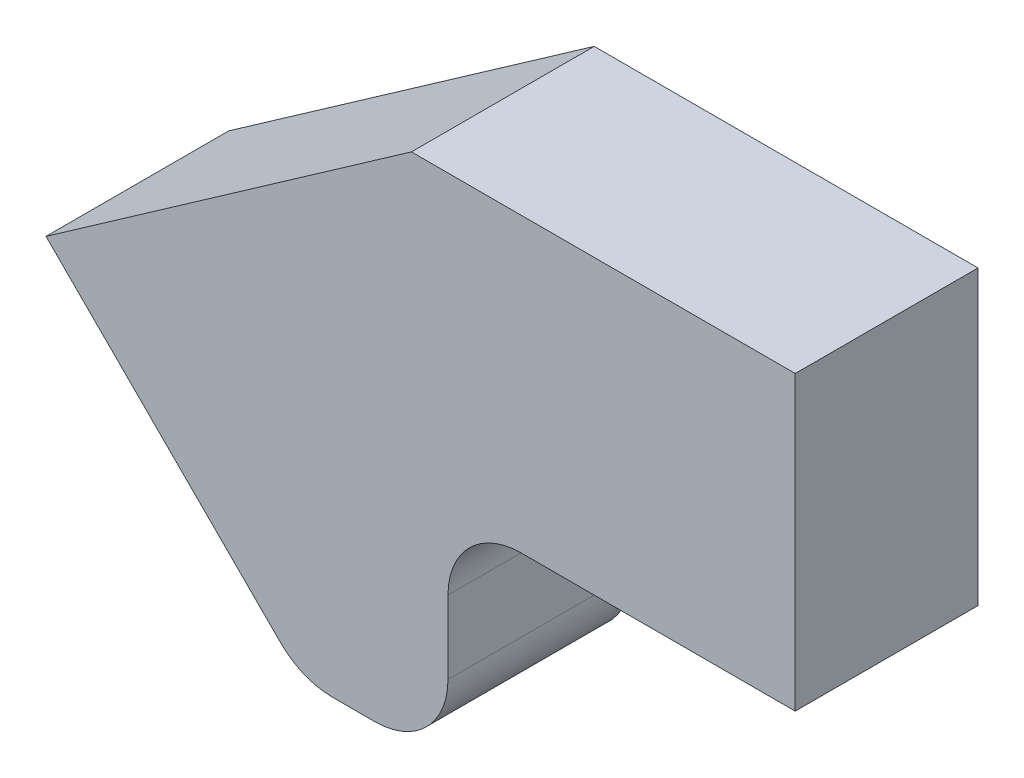
ISO-10303-21;
HEADER;
FILE_DESCRIPTION(('STEP AP214'),'2;1');
FILE_NAME('part.step','',(''),(''),'','','');
FILE_SCHEMA(('AUTOMOTIVE_DESIGN { 1 0 10303 214 1 1 1 1 }'));
ENDSEC;
DATA;
#1=APPLICATION_CONTEXT('core data for automotive mechanical design processes');
#2=APPLICATION_PROTOCOL_DEFINITION('international standard','automotive_design',2000,#1);
#3=PRODUCT_CONTEXT('',#1,'mechanical');
#4=PRODUCT('Part','Part','',(#3));
#5=PRODUCT_RELATED_PRODUCT_CATEGORY('part','',(#4));
#6=PRODUCT_DEFINITION_FORMATION('','',#4);
#7=PRODUCT_DEFINITION_CONTEXT('part definition',#1,'design');
#8=PRODUCT_DEFINITION('design','',#6,#7);
#9=PRODUCT_DEFINITION_SHAPE('','',#8);
#10=(LENGTH_UNIT() NAMED_UNIT(*) SI_UNIT(.MILLI.,.METRE.));
#11=(NAMED_UNIT(*) PLANE_ANGLE_UNIT() SI_UNIT($,.RADIAN.));
#12=(NAMED_UNIT(*) SI_UNIT($,.STERADIAN.) SOLID_ANGLE_UNIT());
#13=UNCERTAINTY_MEASURE_WITH_UNIT(LENGTH_MEASURE(1.E-05),#10,'distance_accuracy_value','');
#14=(GEOMETRIC_REPRESENTATION_CONTEXT(3) GLOBAL_UNCERTAINTY_ASSIGNED_CONTEXT((#13)) GLOBAL_UNIT_ASSIGNED_CONTEXT((#10,
#11,#12)) REPRESENTATION_CONTEXT('',''));
#15=CARTESIAN_POINT('',(0.,0.,0.));
#16=DIRECTION('',(0.,0.,1.));
#17=DIRECTION('',(1.,0.,0.));
#18=AXIS2_PLACEMENT_3D('',#15,#16,#17);
#19=CARTESIAN_POINT('',(0.350000000000004,-0.35,0.125));
#20=DIRECTION('',(0.707106781186544,0.707106781186552,0.));
#21=DIRECTION('',(-0.707106781186551,0.707106781186544,0.));
#22=AXIS2_PLACEMENT_3D('',#19,#20,#21);
#23=PLANE('',#22);
#24=DIRECTION('',(0.707106781186551,-0.707106781186544,0.));
#25=VECTOR('',#24,1.);
#26=CARTESIAN_POINT('',(0.350000000000004,-0.35,-0.125));
#27=LINE('',#26,#25);
#28=CARTESIAN_POINT('',(0.,0.,-0.125));
#29=VERTEX_POINT('',#28);
#30=CARTESIAN_POINT('',(0.320710678118659,-0.320710678118655,-0.125));
#31=VERTEX_POINT('',#30);
#32=EDGE_CURVE('E141',#29,#31,#27,.T.);
#33=ORIENTED_EDGE('',*,*,#32,.T.);
#34=DIRECTION('',(0.,0.,-1.));
#35=VECTOR('',#34,1.);
#36=CARTESIAN_POINT('',(0.320710678118659,-0.320710678118655,0.125));
#37=LINE('',#36,#35);
#38=CARTESIAN_POINT('',(0.320710678118659,-0.320710678118655,0.125));
#39=VERTEX_POINT('',#38);
#40=EDGE_CURVE('E54',#31,#39,#37,.F.);
#41=ORIENTED_EDGE('',*,*,#40,.T.);
#42=DIRECTION('',(0.707106781186551,-0.707106781186544,0.));
#43=VECTOR('',#42,1.);
#44=CARTESIAN_POINT('',(0.350000000000004,-0.35,0.125));
#45=LINE('',#44,#43);
#46=CARTESIAN_POINT('',(0.,0.,0.125));
#47=VERTEX_POINT('',#46);
#48=EDGE_CURVE('E156',#47,#39,#45,.T.);
#49=ORIENTED_EDGE('',*,*,#48,.F.);
#50=DIRECTION('',(0.,0.,-1.));
#51=VECTOR('',#50,1.);
#52=CARTESIAN_POINT('',(0.,0.,0.125));
#53=LINE('',#52,#51);
#54=EDGE_CURVE('E140',#47,#29,#53,.T.);
#55=ORIENTED_EDGE('',*,*,#54,.T.);
#56=EDGE_LOOP('',(#33,#41,#49,#55));
#57=FACE_BOUND('',#56,.T.);
#58=ADVANCED_FACE('F33',(#57),#23,.F.);
#59=CARTESIAN_POINT('',(0.549851802359739,-0.35,0.125));
#60=DIRECTION('',(0.,1.,0.));
#61=DIRECTION('',(0.,0.,1.));
#62=AXIS2_PLACEMENT_3D('',#59,#60,#61);
#63=PLANE('',#62);
#64=DIRECTION('',(1.,0.,0.));
#65=VECTOR('',#64,1.);
#66=CARTESIAN_POINT('',(0.549851802359739,-0.35,-0.125));
#67=LINE('',#66,#65);
#68=CARTESIAN_POINT('',(0.391421356237313,-0.35,-0.125));
#69=VERTEX_POINT('',#68);
#70=CARTESIAN_POINT('',(0.449851802359739,-0.35,-0.125));
#71=VERTEX_POINT('',#70);
#72=EDGE_CURVE('E143',#69,#71,#67,.T.);
#73=ORIENTED_EDGE('',*,*,#72,.T.);
#74=DIRECTION('',(0.,0.,-1.));
#75=VECTOR('',#74,1.);
#76=CARTESIAN_POINT('',(0.449851802359739,-0.35,0.125));
#77=LINE('',#76,#75);
#78=CARTESIAN_POINT('',(0.449851802359739,-0.35,0.125));
#79=VERTEX_POINT('',#78);
#80=EDGE_CURVE('E174',#71,#79,#77,.F.);
#81=ORIENTED_EDGE('',*,*,#80,.T.);
#82=DIRECTION('',(1.,0.,0.));
#83=VECTOR('',#82,1.);
#84=CARTESIAN_POINT('',(0.549851802359739,-0.35,0.125));
#85=LINE('',#84,#83);
#86=CARTESIAN_POINT('',(0.391421356237313,-0.35,0.125));
#87=VERTEX_POINT('',#86);
#88=EDGE_CURVE('E306',#87,#79,#85,.T.);
#89=ORIENTED_EDGE('',*,*,#88,.F.);
#90=DIRECTION('',(0.,0.,-1.));
#91=VECTOR('',#90,1.);
#92=CARTESIAN_POINT('',(0.391421356237313,-0.35,0.125));
#93=LINE('',#92,#91);
#94=EDGE_CURVE('E171',#87,#69,#93,.T.);
#95=ORIENTED_EDGE('',*,*,#94,.T.);
#96=EDGE_LOOP('',(#73,#81,#89,#95));
#97=FACE_BOUND('',#96,.T.);
#98=ADVANCED_FACE('F202',(#97),#63,.F.);
#99=CARTESIAN_POINT('',(0.549851802359739,-0.0500000000000001,0.125));
#100=DIRECTION('',(-1.,0.,0.));
#101=DIRECTION('',(0.,-1.,0.));
#102=AXIS2_PLACEMENT_3D('',#99,#100,#101);
#103=PLANE('',#102);
#104=DIRECTION('',(0.,1.,0.));
#105=VECTOR('',#104,1.);
#106=CARTESIAN_POINT('',(0.549851802359739,-0.0500000000000001,0.125));
#107=LINE('',#106,#105);
#108=CARTESIAN_POINT('',(0.549851802359739,-0.25,0.125));
#109=VERTEX_POINT('',#108);
#110=CARTESIAN_POINT('',(0.549851802359739,-0.15,0.125));
#111=VERTEX_POINT('',#110);
#112=EDGE_CURVE('E118',#109,#111,#107,.T.);
#113=ORIENTED_EDGE('',*,*,#112,.F.);
#114=DIRECTION('',(0.,0.,-1.));
#115=VECTOR('',#114,1.);
#116=CARTESIAN_POINT('',(0.549851802359739,-0.25,0.125));
#117=LINE('',#116,#115);
#118=CARTESIAN_POINT('',(0.549851802359739,-0.25,-0.125));
#119=VERTEX_POINT('',#118);
#120=EDGE_CURVE('E164',#109,#119,#117,.T.);
#121=ORIENTED_EDGE('',*,*,#120,.T.);
#122=DIRECTION('',(0.,1.,0.));
#123=VECTOR('',#122,1.);
#124=CARTESIAN_POINT('',(0.549851802359739,-0.0500000000000001,-0.125));
#125=LINE('',#124,#123);
#126=CARTESIAN_POINT('',(0.549851802359739,-0.15,-0.125));
#127=VERTEX_POINT('',#126);
#128=EDGE_CURVE('E146',#119,#127,#125,.T.);
#129=ORIENTED_EDGE('',*,*,#128,.T.);
#130=DIRECTION('',(0.,0.,-1.));
#131=VECTOR('',#130,1.);
#132=CARTESIAN_POINT('',(0.549851802359739,-0.15,0.125));
#133=LINE('',#132,#131);
#134=EDGE_CURVE('E127',#127,#111,#133,.F.);
#135=ORIENTED_EDGE('',*,*,#134,.T.);
#136=EDGE_LOOP('',(#113,#121,#129,#135));
#137=FACE_BOUND('',#136,.T.);
#138=ADVANCED_FACE('F189',(#137),#103,.F.);
#139=CARTESIAN_POINT('',(1.02485180235974,-0.05,0.125));
#140=DIRECTION('',(0.,1.,0.));
#141=DIRECTION('',(-1.,0.,0.));
#142=AXIS2_PLACEMENT_3D('',#139,#140,#141);
#143=PLANE('',#142);
#144=DIRECTION('',(1.,0.,0.));
#145=VECTOR('',#144,1.);
#146=CARTESIAN_POINT('',(1.02485180235974,-0.05,0.125));
#147=LINE('',#146,#145);
#148=CARTESIAN_POINT('',(0.649851802359739,-0.0500000000000001,0.125));
#149=VERTEX_POINT('',#148);
#150=CARTESIAN_POINT('',(1.02485180235974,-0.05,0.125));
#151=VERTEX_POINT('',#150);
#152=EDGE_CURVE('E108',#149,#151,#147,.T.);
#153=ORIENTED_EDGE('',*,*,#152,.F.);
#154=DIRECTION('',(0.,0.,-1.));
#155=VECTOR('',#154,1.);
#156=CARTESIAN_POINT('',(0.649851802359739,-0.0500000000000001,-0.125));
#157=LINE('',#156,#155);
#158=CARTESIAN_POINT('',(0.649851802359739,-0.0500000000000001,-0.125));
#159=VERTEX_POINT('',#158);
#160=EDGE_CURVE('E180',#149,#159,#157,.T.);
#161=ORIENTED_EDGE('',*,*,#160,.T.);
#162=DIRECTION('',(1.,0.,0.));
#163=VECTOR('',#162,1.);
#164=CARTESIAN_POINT('',(1.02485180235974,-0.05,-0.125));
#165=LINE('',#164,#163);
#166=CARTESIAN_POINT('',(1.02485180235974,-0.05,-0.125));
#167=VERTEX_POINT('',#166);
#168=EDGE_CURVE('E124',#159,#167,#165,.T.);
#169=ORIENTED_EDGE('',*,*,#168,.T.);
#170=DIRECTION('',(0.,0.,-1.));
#171=VECTOR('',#170,1.);
#172=CARTESIAN_POINT('',(1.02485180235974,-0.05,0.125));
#173=LINE('',#172,#171);
#174=EDGE_CURVE('E121',#151,#167,#173,.T.);
#175=ORIENTED_EDGE('',*,*,#174,.F.);
#176=EDGE_LOOP('',(#153,#161,#169,#175));
#177=FACE_BOUND('',#176,.T.);
#178=ADVANCED_FACE('F122',(#177),#143,.F.);
#179=CARTESIAN_POINT('',(1.02485180235974,0.35,0.125));
#180=DIRECTION('',(-1.,0.,0.));
#181=DIRECTION('',(0.,0.,1.));
#182=AXIS2_PLACEMENT_3D('',#179,#180,#181);
#183=PLANE('',#182);
#184=DIRECTION('',(0.,1.,0.));
#185=VECTOR('',#184,1.);
#186=CARTESIAN_POINT('',(1.02485180235974,0.35,-0.125));
#187=LINE('',#186,#185);
#188=CARTESIAN_POINT('',(1.02485180235974,0.35,-0.125));
#189=VERTEX_POINT('',#188);
#190=EDGE_CURVE('E150',#167,#189,#187,.T.);
#191=ORIENTED_EDGE('',*,*,#190,.T.);
#192=DIRECTION('',(0.,0.,-1.));
#193=VECTOR('',#192,1.);
#194=CARTESIAN_POINT('',(1.02485180235974,0.35,0.125));
#195=LINE('',#194,#193);
#196=CARTESIAN_POINT('',(1.02485180235974,0.35,0.125));
#197=VERTEX_POINT('',#196);
#198=EDGE_CURVE('E128',#197,#189,#195,.T.);
#199=ORIENTED_EDGE('',*,*,#198,.F.);
#200=DIRECTION('',(0.,1.,0.));
#201=VECTOR('',#200,1.);
#202=CARTESIAN_POINT('',(1.02485180235974,0.35,0.125));
#203=LINE('',#202,#201);
#204=EDGE_CURVE('E113',#151,#197,#203,.T.);
#205=ORIENTED_EDGE('',*,*,#204,.F.);
#206=ORIENTED_EDGE('',*,*,#174,.T.);
#207=EDGE_LOOP('',(#191,#199,#205,#206));
#208=FACE_BOUND('',#207,.T.);
#209=ADVANCED_FACE('F130',(#208),#183,.F.);
#210=CARTESIAN_POINT('',(0.499851802359739,0.35,0.125));
#211=DIRECTION('',(0.,-1.,0.));
#212=DIRECTION('',(1.,0.,0.));
#213=AXIS2_PLACEMENT_3D('',#210,#211,#212);
#214=PLANE('',#213);
#215=DIRECTION('',(-1.,0.,0.));
#216=VECTOR('',#215,1.);
#217=CARTESIAN_POINT('',(0.499851802359739,0.35,-0.125));
#218=LINE('',#217,#216);
#219=CARTESIAN_POINT('',(0.499851802359739,0.35,-0.125));
#220=VERTEX_POINT('',#219);
#221=EDGE_CURVE('E152',#189,#220,#218,.T.);
#222=ORIENTED_EDGE('',*,*,#221,.T.);
#223=DIRECTION('',(0.,0.,-1.));
#224=VECTOR('',#223,1.);
#225=CARTESIAN_POINT('',(0.499851802359739,0.35,0.125));
#226=LINE('',#225,#224);
#227=CARTESIAN_POINT('',(0.499851802359739,0.35,0.125));
#228=VERTEX_POINT('',#227);
#229=EDGE_CURVE('E159',#228,#220,#226,.T.);
#230=ORIENTED_EDGE('',*,*,#229,.F.);
#231=DIRECTION('',(-1.,0.,0.));
#232=VECTOR('',#231,1.);
#233=CARTESIAN_POINT('',(0.499851802359739,0.35,0.125));
#234=LINE('',#233,#232);
#235=EDGE_CURVE('E133',#197,#228,#234,.T.);
#236=ORIENTED_EDGE('',*,*,#235,.F.);
#237=ORIENTED_EDGE('',*,*,#198,.T.);
#238=EDGE_LOOP('',(#222,#230,#236,#237));
#239=FACE_BOUND('',#238,.T.);
#240=ADVANCED_FACE('F216',(#239),#214,.F.);
#241=CARTESIAN_POINT('',(0.,0.,0.125));
#242=DIRECTION('',(0.573576436351047,-0.819152044288991,0.));
#243=DIRECTION('',(0.819152044288991,0.573576436351047,0.));
#244=AXIS2_PLACEMENT_3D('',#241,#242,#243);
#245=PLANE('',#244);
#246=DIRECTION('',(-0.819152044288991,-0.573576436351047,0.));
#247=VECTOR('',#246,1.);
#248=CARTESIAN_POINT('',(0.,0.,-0.125));
#249=LINE('',#248,#247);
#250=EDGE_CURVE('E154',#220,#29,#249,.T.);
#251=ORIENTED_EDGE('',*,*,#250,.T.);
#252=ORIENTED_EDGE('',*,*,#54,.F.);
#253=DIRECTION('',(-0.819152044288991,-0.573576436351047,0.));
#254=VECTOR('',#253,1.);
#255=CARTESIAN_POINT('',(0.,0.,0.125));
#256=LINE('',#255,#254);
#257=EDGE_CURVE('E135',#228,#47,#256,.T.);
#258=ORIENTED_EDGE('',*,*,#257,.F.);
#259=ORIENTED_EDGE('',*,*,#229,.T.);
#260=EDGE_LOOP('',(#251,#252,#258,#259));
#261=FACE_BOUND('',#260,.T.);
#262=ADVANCED_FACE('F219',(#261),#245,.F.);
#263=CARTESIAN_POINT('',(0.,0.,0.125));
#264=DIRECTION('',(0.,0.,-1.));
#265=DIRECTION('',(-1.,0.,0.));
#266=AXIS2_PLACEMENT_3D('',#263,#264,#265);
#267=PLANE('',#266);
#268=ORIENTED_EDGE('',*,*,#88,.T.);
#269=CARTESIAN_POINT('',(0.449851802359739,-0.25,0.125));
#270=DIRECTION('',(0.,0.,-1.));
#271=DIRECTION('',(-1.,0.,0.));
#272=AXIS2_PLACEMENT_3D('',#269,#270,#271);
#273=CIRCLE('',#272,0.1);
#274=EDGE_CURVE('E178',#79,#109,#273,.F.);
#275=ORIENTED_EDGE('',*,*,#274,.T.);
#276=ORIENTED_EDGE('',*,*,#112,.T.);
#277=CARTESIAN_POINT('',(0.649851802359739,-0.15,0.125));
#278=DIRECTION('',(0.,0.,-1.));
#279=DIRECTION('',(-1.,0.,0.));
#280=AXIS2_PLACEMENT_3D('',#277,#278,#279);
#281=CIRCLE('',#280,0.1);
#282=EDGE_CURVE('E11',#111,#149,#281,.T.);
#283=ORIENTED_EDGE('',*,*,#282,.T.);
#284=ORIENTED_EDGE('',*,*,#152,.T.);
#285=ORIENTED_EDGE('',*,*,#204,.T.);
#286=ORIENTED_EDGE('',*,*,#235,.T.);
#287=ORIENTED_EDGE('',*,*,#257,.T.);
#288=ORIENTED_EDGE('',*,*,#48,.T.);
#289=CARTESIAN_POINT('',(0.391421356237313,-0.25,0.125));
#290=DIRECTION('',(0.,0.,-1.));
#291=DIRECTION('',(-1.,0.,0.));
#292=AXIS2_PLACEMENT_3D('',#289,#290,#291);
#293=CIRCLE('',#292,0.1);
#294=EDGE_CURVE('E176',#39,#87,#293,.F.);
#295=ORIENTED_EDGE('',*,*,#294,.T.);
#296=EDGE_LOOP('',(#268,#275,#276,#283,#284,#285,#286,#287,#288,#295));
#297=FACE_BOUND('',#296,.T.);
#298=ADVANCED_FACE('F111',(#297),#267,.F.);
#299=CARTESIAN_POINT('',(0.,0.,-0.125));
#300=DIRECTION('',(0.,0.,-1.));
#301=DIRECTION('',(-1.,0.,0.));
#302=AXIS2_PLACEMENT_3D('',#299,#300,#301);
#303=PLANE('',#302);
#304=ORIENTED_EDGE('',*,*,#128,.F.);
#305=CARTESIAN_POINT('',(0.449851802359739,-0.25,-0.125));
#306=DIRECTION('',(0.,0.,-1.));
#307=DIRECTION('',(-1.,0.,0.));
#308=AXIS2_PLACEMENT_3D('',#305,#306,#307);
#309=CIRCLE('',#308,0.1);
#310=EDGE_CURVE('E169',#119,#71,#309,.T.);
#311=ORIENTED_EDGE('',*,*,#310,.T.);
#312=ORIENTED_EDGE('',*,*,#72,.F.);
#313=CARTESIAN_POINT('',(0.391421356237313,-0.25,-0.125));
#314=DIRECTION('',(0.,0.,-1.));
#315=DIRECTION('',(-1.,0.,0.));
#316=AXIS2_PLACEMENT_3D('',#313,#314,#315);
#317=CIRCLE('',#316,0.1);
#318=EDGE_CURVE('E167',#69,#31,#317,.T.);
#319=ORIENTED_EDGE('',*,*,#318,.T.);
#320=ORIENTED_EDGE('',*,*,#32,.F.);
#321=ORIENTED_EDGE('',*,*,#250,.F.);
#322=ORIENTED_EDGE('',*,*,#221,.F.);
#323=ORIENTED_EDGE('',*,*,#190,.F.);
#324=ORIENTED_EDGE('',*,*,#168,.F.);
#325=CARTESIAN_POINT('',(0.649851802359739,-0.15,-0.125));
#326=DIRECTION('',(0.,0.,-1.));
#327=DIRECTION('',(-1.,0.,0.));
#328=AXIS2_PLACEMENT_3D('',#325,#326,#327);
#329=CIRCLE('',#328,0.1);
#330=EDGE_CURVE('E41',#159,#127,#329,.F.);
#331=ORIENTED_EDGE('',*,*,#330,.T.);
#332=EDGE_LOOP('',(#304,#311,#312,#319,#320,#321,#322,#323,#324,#331));
#333=FACE_BOUND('',#332,.T.);
#334=ADVANCED_FACE('F184',(#333),#303,.T.);
#335=CARTESIAN_POINT('',(0.449851802359739,-0.25,0.125));
#336=DIRECTION('',(0.,0.,-1.));
#337=DIRECTION('',(-1.,0.,0.));
#338=AXIS2_PLACEMENT_3D('',#335,#336,#337);
#339=CYLINDRICAL_SURFACE('',#338,0.1);
#340=ORIENTED_EDGE('',*,*,#274,.F.);
#341=ORIENTED_EDGE('',*,*,#80,.F.);
#342=ORIENTED_EDGE('',*,*,#310,.F.);
#343=ORIENTED_EDGE('',*,*,#120,.F.);
#344=EDGE_LOOP('',(#340,#341,#342,#343));
#345=FACE_BOUND('',#344,.T.);
#346=ADVANCED_FACE('F193',(#345),#339,.T.);
#347=CARTESIAN_POINT('',(0.649851802359739,-0.15,0.125));
#348=DIRECTION('',(0.,0.,1.));
#349=DIRECTION('',(1.,0.,0.));
#350=AXIS2_PLACEMENT_3D('',#347,#348,#349);
#351=CYLINDRICAL_SURFACE('',#350,0.1);
#352=ORIENTED_EDGE('',*,*,#282,.F.);
#353=ORIENTED_EDGE('',*,*,#134,.F.);
#354=ORIENTED_EDGE('',*,*,#330,.F.);
#355=ORIENTED_EDGE('',*,*,#160,.F.);
#356=EDGE_LOOP('',(#352,#353,#354,#355));
#357=FACE_BOUND('',#356,.T.);
#358=ADVANCED_FACE('F191',(#357),#351,.F.);
#359=CARTESIAN_POINT('',(0.391421356237313,-0.25,0.125));
#360=DIRECTION('',(0.,0.,-1.));
#361=DIRECTION('',(-1.,0.,0.));
#362=AXIS2_PLACEMENT_3D('',#359,#360,#361);
#363=CYLINDRICAL_SURFACE('',#362,0.1);
#364=ORIENTED_EDGE('',*,*,#294,.F.);
#365=ORIENTED_EDGE('',*,*,#40,.F.);
#366=ORIENTED_EDGE('',*,*,#318,.F.);
#367=ORIENTED_EDGE('',*,*,#94,.F.);
#368=EDGE_LOOP('',(#364,#365,#366,#367));
#369=FACE_BOUND('',#368,.T.);
#370=ADVANCED_FACE('F35',(#369),#363,.T.);
#371=CLOSED_SHELL('',(#58,#98,#138,#178,#209,#240,#262,#298,#334,#346,#358,#370));
#372=MANIFOLD_SOLID_BREP('B2',#371);
#373=ADVANCED_BREP_SHAPE_REPRESENTATION('',(#18,#372),#14);
#374=SHAPE_DEFINITION_REPRESENTATION(#9,#373);
ENDSEC;
END-ISO-10303-21;
